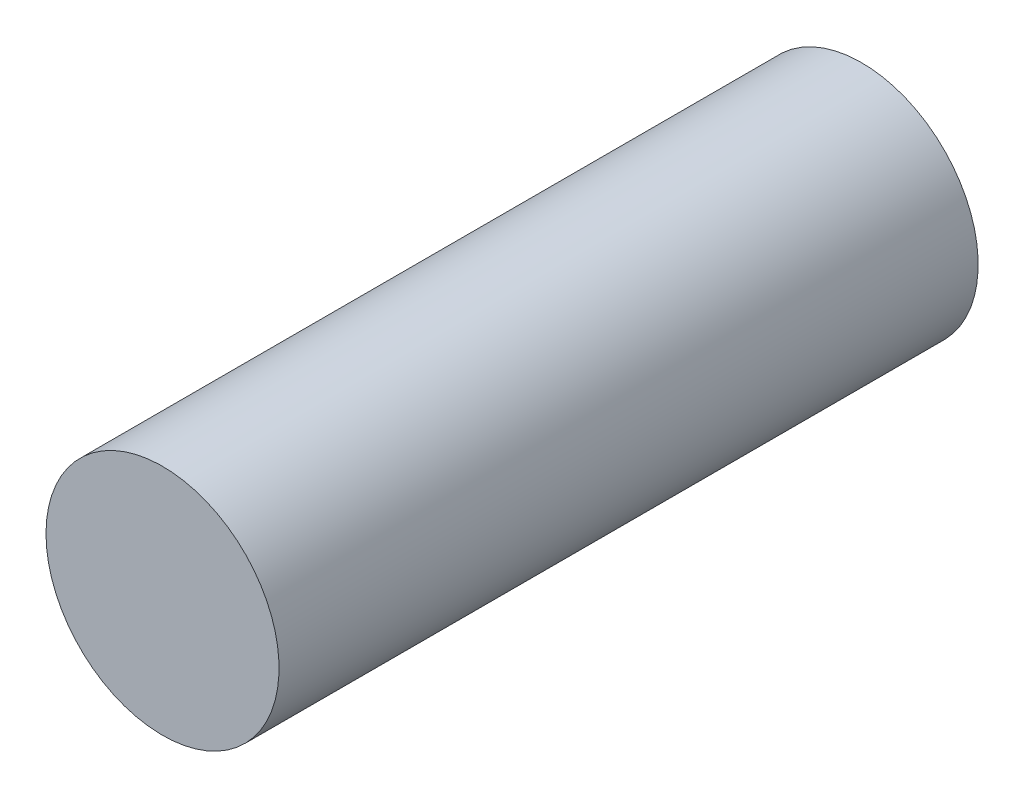
ISO-10303-21;
HEADER;
FILE_DESCRIPTION(('STEP AP214'),'2;1');
FILE_NAME('part.step','',(''),(''),'','','');
FILE_SCHEMA(('AUTOMOTIVE_DESIGN { 1 0 10303 214 1 1 1 1 }'));
ENDSEC;
DATA;
#1=APPLICATION_CONTEXT('core data for automotive mechanical design processes');
#2=APPLICATION_PROTOCOL_DEFINITION('international standard','automotive_design',2000,#1);
#3=PRODUCT_CONTEXT('',#1,'mechanical');
#4=PRODUCT('Part','Part','',(#3));
#5=PRODUCT_RELATED_PRODUCT_CATEGORY('part','',(#4));
#6=PRODUCT_DEFINITION_FORMATION('','',#4);
#7=PRODUCT_DEFINITION_CONTEXT('part definition',#1,'design');
#8=PRODUCT_DEFINITION('design','',#6,#7);
#9=PRODUCT_DEFINITION_SHAPE('','',#8);
#10=(LENGTH_UNIT() NAMED_UNIT(*) SI_UNIT(.MILLI.,.METRE.));
#11=(NAMED_UNIT(*) PLANE_ANGLE_UNIT() SI_UNIT($,.RADIAN.));
#12=(NAMED_UNIT(*) SI_UNIT($,.STERADIAN.) SOLID_ANGLE_UNIT());
#13=UNCERTAINTY_MEASURE_WITH_UNIT(LENGTH_MEASURE(1.E-05),#10,'distance_accuracy_value','');
#14=(GEOMETRIC_REPRESENTATION_CONTEXT(3) GLOBAL_UNCERTAINTY_ASSIGNED_CONTEXT((#13)) GLOBAL_UNIT_ASSIGNED_CONTEXT((#10,
#11,#12)) REPRESENTATION_CONTEXT('',''));
#15=CARTESIAN_POINT('',(0.,0.,0.));
#16=DIRECTION('',(0.,0.,1.));
#17=DIRECTION('',(1.,0.,0.));
#18=AXIS2_PLACEMENT_3D('',#15,#16,#17);
#19=CARTESIAN_POINT('',(0.,0.,19.05));
#20=DIRECTION('',(0.,0.,-1.));
#21=DIRECTION('',(-1.,0.,0.));
#22=AXIS2_PLACEMENT_3D('',#19,#20,#21);
#23=CYLINDRICAL_SURFACE('',#22,3.175);
#24=CARTESIAN_POINT('',(0.,0.,19.05));
#25=DIRECTION('',(0.,0.,1.));
#26=DIRECTION('',(1.,0.,0.));
#27=AXIS2_PLACEMENT_3D('',#24,#25,#26);
#28=CIRCLE('',#27,3.175);
#29=CARTESIAN_POINT('',(-3.175,0.,19.05));
#30=VERTEX_POINT('',#29);
#31=EDGE_CURVE('E10',#30,#30,#28,.T.);
#32=CARTESIAN_POINT('',(0.,0.,0.));
#33=DIRECTION('',(0.,0.,1.));
#34=DIRECTION('',(1.,0.,0.));
#35=AXIS2_PLACEMENT_3D('',#32,#33,#34);
#36=CIRCLE('',#35,3.175);
#37=CARTESIAN_POINT('',(-3.175,0.,0.));
#38=VERTEX_POINT('',#37);
#39=EDGE_CURVE('E40',#38,#38,#36,.T.);
#40=CARTESIAN_POINT('',(-3.175,0.,19.05));
#41=CARTESIAN_POINT('',(-3.175,0.,18.8515625));
#42=CARTESIAN_POINT('',(-3.175,0.,18.653125));
#43=CARTESIAN_POINT('',(-3.175,0.,18.25625));
#44=CARTESIAN_POINT('',(-3.175,0.,18.0578125));
#45=CARTESIAN_POINT('',(-3.175,0.,17.6609375));
#46=CARTESIAN_POINT('',(-3.175,0.,17.4625));
#47=CARTESIAN_POINT('',(-3.175,0.,17.065625));
#48=CARTESIAN_POINT('',(-3.175,0.,16.8671875));
#49=CARTESIAN_POINT('',(-3.175,0.,16.4703125));
#50=CARTESIAN_POINT('',(-3.175,0.,16.271875));
#51=CARTESIAN_POINT('',(-3.175,0.,15.875));
#52=CARTESIAN_POINT('',(-3.175,0.,15.6765625));
#53=CARTESIAN_POINT('',(-3.175,0.,15.2796875));
#54=CARTESIAN_POINT('',(-3.175,0.,15.08125));
#55=CARTESIAN_POINT('',(-3.175,0.,14.684375));
#56=CARTESIAN_POINT('',(-3.175,0.,14.4859375));
#57=CARTESIAN_POINT('',(-3.175,0.,14.0890625));
#58=CARTESIAN_POINT('',(-3.175,0.,13.890625));
#59=CARTESIAN_POINT('',(-3.175,0.,13.49375));
#60=CARTESIAN_POINT('',(-3.175,0.,13.2953125));
#61=CARTESIAN_POINT('',(-3.175,0.,12.8984375));
#62=CARTESIAN_POINT('',(-3.175,0.,12.7));
#63=CARTESIAN_POINT('',(-3.175,0.,12.303125));
#64=CARTESIAN_POINT('',(-3.175,0.,12.1046875));
#65=CARTESIAN_POINT('',(-3.175,0.,11.7078125));
#66=CARTESIAN_POINT('',(-3.175,0.,11.509375));
#67=CARTESIAN_POINT('',(-3.175,0.,11.1125));
#68=CARTESIAN_POINT('',(-3.175,0.,10.9140625));
#69=CARTESIAN_POINT('',(-3.175,0.,10.5171875));
#70=CARTESIAN_POINT('',(-3.175,0.,10.31875));
#71=CARTESIAN_POINT('',(-3.175,0.,9.921875));
#72=CARTESIAN_POINT('',(-3.175,0.,9.7234375));
#73=CARTESIAN_POINT('',(-3.175,0.,9.3265625));
#74=CARTESIAN_POINT('',(-3.175,0.,9.128125));
#75=CARTESIAN_POINT('',(-3.175,0.,8.73125));
#76=CARTESIAN_POINT('',(-3.175,0.,8.5328125));
#77=CARTESIAN_POINT('',(-3.175,0.,8.1359375));
#78=CARTESIAN_POINT('',(-3.175,0.,7.9375));
#79=CARTESIAN_POINT('',(-3.175,0.,7.540625));
#80=CARTESIAN_POINT('',(-3.175,0.,7.3421875));
#81=CARTESIAN_POINT('',(-3.175,0.,6.9453125));
#82=CARTESIAN_POINT('',(-3.175,0.,6.746875));
#83=CARTESIAN_POINT('',(-3.175,0.,6.35));
#84=CARTESIAN_POINT('',(-3.175,0.,6.1515625));
#85=CARTESIAN_POINT('',(-3.175,0.,5.7546875));
#86=CARTESIAN_POINT('',(-3.175,0.,5.55625));
#87=CARTESIAN_POINT('',(-3.175,0.,5.159375));
#88=CARTESIAN_POINT('',(-3.175,0.,4.9609375));
#89=CARTESIAN_POINT('',(-3.175,0.,4.5640625));
#90=CARTESIAN_POINT('',(-3.175,0.,4.365625));
#91=CARTESIAN_POINT('',(-3.175,0.,3.96875));
#92=CARTESIAN_POINT('',(-3.175,0.,3.7703125));
#93=CARTESIAN_POINT('',(-3.175,0.,3.3734375));
#94=CARTESIAN_POINT('',(-3.175,0.,3.175));
#95=CARTESIAN_POINT('',(-3.175,0.,2.778125));
#96=CARTESIAN_POINT('',(-3.175,0.,2.5796875));
#97=CARTESIAN_POINT('',(-3.175,0.,2.1828125));
#98=CARTESIAN_POINT('',(-3.175,0.,1.984375));
#99=CARTESIAN_POINT('',(-3.175,0.,1.5875));
#100=CARTESIAN_POINT('',(-3.175,0.,1.3890625));
#101=CARTESIAN_POINT('',(-3.175,0.,0.992187500000001));
#102=CARTESIAN_POINT('',(-3.175,0.,0.793750000000001));
#103=CARTESIAN_POINT('',(-3.175,0.,0.396875));
#104=CARTESIAN_POINT('',(-3.175,0.,0.1984375));
#105=CARTESIAN_POINT('',(-3.175,0.,0.));
#106=B_SPLINE_CURVE_WITH_KNOTS('',3,(#40,#41,#42,#43,#44,#45,#46,#47,#48,#49,#50,#51,#52,#53,
#54,#55,#56,#57,#58,#59,#60,#61,#62,#63,#64,#65,#66,#67,#68,#69,#70,#71,#72,#73,#74,#75,#76,#77,
#78,#79,#80,#81,#82,#83,#84,#85,#86,#87,#88,#89,#90,#91,#92,#93,#94,#95,#96,#97,#98,#99,#100,
#101,#102,#103,#104,#105),.UNSPECIFIED.,.F.,.F.,(4,2,2,2,2,2,2,2,2,2,2,2,2,2,2,2,2,2,2,2,2,2,2,
2,2,2,2,2,2,2,2,2,4),(0.,0.595312499999997,1.190625,1.7859375,2.38125,2.9765625,3.571875,
4.1671875,4.7625,5.3578125,5.953125,6.5484375,7.14375,7.7390625,8.334375,8.9296875,9.525,
10.1203125,10.715625,11.3109375,11.90625,12.5015625,13.096875,13.6921875,14.2875,14.8828125,
15.478125,16.0734375,16.66875,17.2640625,17.859375,18.4546875,19.05),.UNSPECIFIED.);
#107=EDGE_CURVE('BSEAM37',#30,#38,#106,.T.);
#108=ORIENTED_EDGE('',*,*,#31,.F.);
#109=ORIENTED_EDGE('',*,*,#39,.T.);
#110=ORIENTED_EDGE('',*,*,#107,.T.);
#111=ORIENTED_EDGE('',*,*,#107,.F.);
#112=EDGE_LOOP('',(#108,#110,#109,#111));
#113=FACE_BOUND('',#112,.T.);
#114=ADVANCED_FACE('F37',(#113),#23,.T.);
#115=CARTESIAN_POINT('',(0.,0.,19.05));
#116=DIRECTION('',(0.,0.,1.));
#117=DIRECTION('',(1.,0.,0.));
#118=AXIS2_PLACEMENT_3D('',#115,#116,#117);
#119=PLANE('',#118);
#120=ORIENTED_EDGE('',*,*,#31,.T.);
#121=EDGE_LOOP('',(#120));
#122=FACE_BOUND('',#121,.T.);
#123=ADVANCED_FACE('F54',(#122),#119,.T.);
#124=CARTESIAN_POINT('',(0.,0.,0.));
#125=DIRECTION('',(0.,0.,1.));
#126=DIRECTION('',(1.,0.,0.));
#127=AXIS2_PLACEMENT_3D('',#124,#125,#126);
#128=PLANE('',#127);
#129=ORIENTED_EDGE('',*,*,#39,.F.);
#130=EDGE_LOOP('',(#129));
#131=FACE_BOUND('',#130,.T.);
#132=ADVANCED_FACE('F52',(#131),#128,.F.);
#133=CLOSED_SHELL('',(#114,#123,#132));
#134=MANIFOLD_SOLID_BREP('B2',#133);
#135=ADVANCED_BREP_SHAPE_REPRESENTATION('',(#18,#134),#14);
#136=SHAPE_DEFINITION_REPRESENTATION(#9,#135);
ENDSEC;
END-ISO-10303-21;
